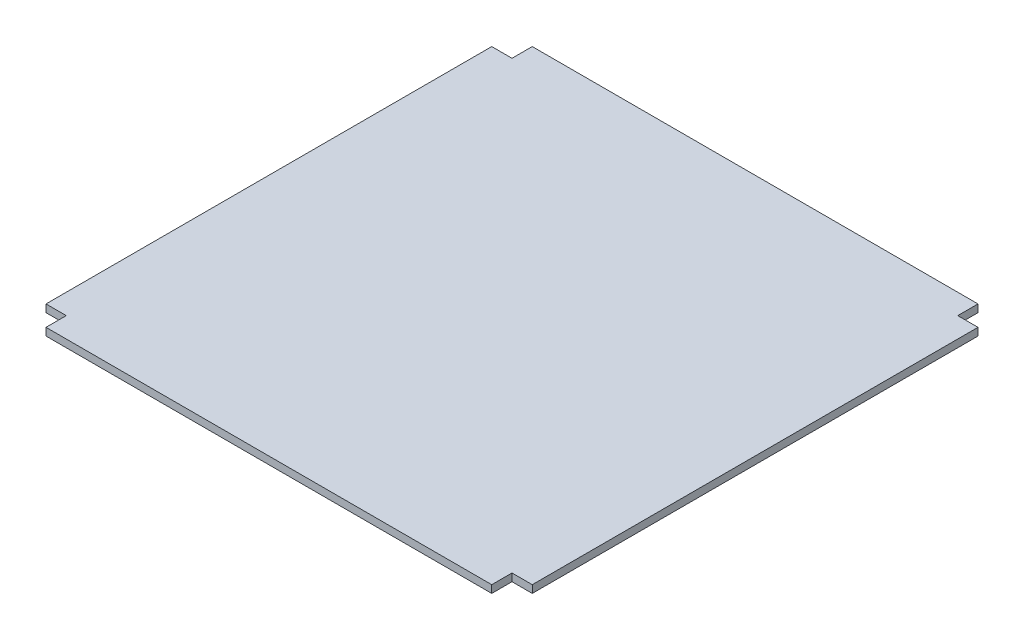
ISO-10303-21;
HEADER;
FILE_DESCRIPTION(('STEP AP214'),'2;1');
FILE_NAME('part.step','',(''),(''),'','','');
FILE_SCHEMA(('AUTOMOTIVE_DESIGN { 1 0 10303 214 1 1 1 1 }'));
ENDSEC;
DATA;
#1=APPLICATION_CONTEXT('core data for automotive mechanical design processes');
#2=APPLICATION_PROTOCOL_DEFINITION('international standard','automotive_design',2000,#1);
#3=PRODUCT_CONTEXT('',#1,'mechanical');
#4=PRODUCT('Part','Part','',(#3));
#5=PRODUCT_RELATED_PRODUCT_CATEGORY('part','',(#4));
#6=PRODUCT_DEFINITION_FORMATION('','',#4);
#7=PRODUCT_DEFINITION_CONTEXT('part definition',#1,'design');
#8=PRODUCT_DEFINITION('design','',#6,#7);
#9=PRODUCT_DEFINITION_SHAPE('','',#8);
#10=(LENGTH_UNIT() NAMED_UNIT(*) SI_UNIT(.MILLI.,.METRE.));
#11=(NAMED_UNIT(*) PLANE_ANGLE_UNIT() SI_UNIT($,.RADIAN.));
#12=(NAMED_UNIT(*) SI_UNIT($,.STERADIAN.) SOLID_ANGLE_UNIT());
#13=UNCERTAINTY_MEASURE_WITH_UNIT(LENGTH_MEASURE(1.E-05),#10,'distance_accuracy_value','');
#14=(GEOMETRIC_REPRESENTATION_CONTEXT(3) GLOBAL_UNCERTAINTY_ASSIGNED_CONTEXT((#13)) GLOBAL_UNIT_ASSIGNED_CONTEXT((#10,
#11,#12)) REPRESENTATION_CONTEXT('',''));
#15=CARTESIAN_POINT('',(0.,0.,0.));
#16=DIRECTION('',(0.,0.,1.));
#17=DIRECTION('',(1.,0.,0.));
#18=AXIS2_PLACEMENT_3D('',#15,#16,#17);
#19=CARTESIAN_POINT('',(609.6,9.525,609.6));
#20=DIRECTION('',(-1.,0.,0.));
#21=DIRECTION('',(0.,0.,1.));
#22=AXIS2_PLACEMENT_3D('',#19,#20,#21);
#23=PLANE('',#22);
#24=DIRECTION('',(0.,0.,-1.));
#25=VECTOR('',#24,1.);
#26=CARTESIAN_POINT('',(609.6,9.525,609.6));
#27=LINE('',#26,#25);
#28=CARTESIAN_POINT('',(609.600000000001,9.525,558.8));
#29=VERTEX_POINT('',#28);
#30=CARTESIAN_POINT('',(609.6,9.525,-558.8));
#31=VERTEX_POINT('',#30);
#32=EDGE_CURVE('E156',#29,#31,#27,.T.);
#33=ORIENTED_EDGE('',*,*,#32,.F.);
#34=DIRECTION('',(0.,1.,0.));
#35=VECTOR('',#34,1.);
#36=CARTESIAN_POINT('',(609.600000000001,-9.525,558.8));
#37=LINE('',#36,#35);
#38=CARTESIAN_POINT('',(609.600000000001,-9.525,558.8));
#39=VERTEX_POINT('',#38);
#40=EDGE_CURVE('E258',#39,#29,#37,.T.);
#41=ORIENTED_EDGE('',*,*,#40,.F.);
#42=DIRECTION('',(0.,0.,-1.));
#43=VECTOR('',#42,1.);
#44=CARTESIAN_POINT('',(609.6,-9.525,609.6));
#45=LINE('',#44,#43);
#46=CARTESIAN_POINT('',(609.6,-9.525,-558.8));
#47=VERTEX_POINT('',#46);
#48=EDGE_CURVE('E158',#39,#47,#45,.T.);
#49=ORIENTED_EDGE('',*,*,#48,.T.);
#50=DIRECTION('',(0.,1.,0.));
#51=VECTOR('',#50,1.);
#52=CARTESIAN_POINT('',(609.6,-9.525,-558.8));
#53=LINE('',#52,#51);
#54=EDGE_CURVE('E140',#47,#31,#53,.T.);
#55=ORIENTED_EDGE('',*,*,#54,.T.);
#56=EDGE_LOOP('',(#33,#41,#49,#55));
#57=FACE_BOUND('',#56,.T.);
#58=ADVANCED_FACE('F47',(#57),#23,.F.);
#59=CARTESIAN_POINT('',(-609.6,9.525,-609.6));
#60=DIRECTION('',(0.,0.,1.));
#61=DIRECTION('',(1.,0.,0.));
#62=AXIS2_PLACEMENT_3D('',#59,#60,#61);
#63=PLANE('',#62);
#64=DIRECTION('',(-1.,0.,0.));
#65=VECTOR('',#64,1.);
#66=CARTESIAN_POINT('',(-609.6,9.525,-609.6));
#67=LINE('',#66,#65);
#68=CARTESIAN_POINT('',(558.800000000001,9.525,-609.6));
#69=VERTEX_POINT('',#68);
#70=CARTESIAN_POINT('',(-558.800000000001,9.525,-609.6));
#71=VERTEX_POINT('',#70);
#72=EDGE_CURVE('E168',#69,#71,#67,.T.);
#73=ORIENTED_EDGE('',*,*,#72,.F.);
#74=DIRECTION('',(0.,1.,0.));
#75=VECTOR('',#74,1.);
#76=CARTESIAN_POINT('',(558.800000000001,-9.525,-609.6));
#77=LINE('',#76,#75);
#78=CARTESIAN_POINT('',(558.800000000001,-9.525,-609.6));
#79=VERTEX_POINT('',#78);
#80=EDGE_CURVE('E248',#79,#69,#77,.T.);
#81=ORIENTED_EDGE('',*,*,#80,.F.);
#82=DIRECTION('',(-1.,0.,0.));
#83=VECTOR('',#82,1.);
#84=CARTESIAN_POINT('',(-609.6,-9.525,-609.6));
#85=LINE('',#84,#83);
#86=CARTESIAN_POINT('',(-558.800000000001,-9.525,-609.6));
#87=VERTEX_POINT('',#86);
#88=EDGE_CURVE('E184',#79,#87,#85,.T.);
#89=ORIENTED_EDGE('',*,*,#88,.T.);
#90=DIRECTION('',(0.,1.,0.));
#91=VECTOR('',#90,1.);
#92=CARTESIAN_POINT('',(-558.800000000001,-9.525,-609.6));
#93=LINE('',#92,#91);
#94=EDGE_CURVE('E185',#87,#71,#93,.T.);
#95=ORIENTED_EDGE('',*,*,#94,.T.);
#96=EDGE_LOOP('',(#73,#81,#89,#95));
#97=FACE_BOUND('',#96,.T.);
#98=ADVANCED_FACE('F245',(#97),#63,.F.);
#99=CARTESIAN_POINT('',(-609.6,9.525,609.6));
#100=DIRECTION('',(1.,0.,0.));
#101=DIRECTION('',(0.,0.,-1.));
#102=AXIS2_PLACEMENT_3D('',#99,#100,#101);
#103=PLANE('',#102);
#104=DIRECTION('',(0.,0.,1.));
#105=VECTOR('',#104,1.);
#106=CARTESIAN_POINT('',(-609.6,-9.525,609.6));
#107=LINE('',#106,#105);
#108=CARTESIAN_POINT('',(-609.6,-9.525,-558.8));
#109=VERTEX_POINT('',#108);
#110=CARTESIAN_POINT('',(-609.6,-9.525,558.8));
#111=VERTEX_POINT('',#110);
#112=EDGE_CURVE('E175',#109,#111,#107,.T.);
#113=ORIENTED_EDGE('',*,*,#112,.T.);
#114=DIRECTION('',(0.,1.,0.));
#115=VECTOR('',#114,1.);
#116=CARTESIAN_POINT('',(-609.6,-9.525,558.8));
#117=LINE('',#116,#115);
#118=CARTESIAN_POINT('',(-609.6,9.525,558.8));
#119=VERTEX_POINT('',#118);
#120=EDGE_CURVE('E196',#111,#119,#117,.T.);
#121=ORIENTED_EDGE('',*,*,#120,.T.);
#122=DIRECTION('',(0.,0.,1.));
#123=VECTOR('',#122,1.);
#124=CARTESIAN_POINT('',(-609.6,9.525,609.6));
#125=LINE('',#124,#123);
#126=CARTESIAN_POINT('',(-609.6,9.525,-558.8));
#127=VERTEX_POINT('',#126);
#128=EDGE_CURVE('E56',#127,#119,#125,.T.);
#129=ORIENTED_EDGE('',*,*,#128,.F.);
#130=DIRECTION('',(0.,1.,0.));
#131=VECTOR('',#130,1.);
#132=CARTESIAN_POINT('',(-609.6,-9.525,-558.8));
#133=LINE('',#132,#131);
#134=EDGE_CURVE('E177',#109,#127,#133,.T.);
#135=ORIENTED_EDGE('',*,*,#134,.F.);
#136=EDGE_LOOP('',(#113,#121,#129,#135));
#137=FACE_BOUND('',#136,.T.);
#138=ADVANCED_FACE('F194',(#137),#103,.F.);
#139=CARTESIAN_POINT('',(-609.6,9.525,609.6));
#140=DIRECTION('',(0.,0.,-1.));
#141=DIRECTION('',(-1.,0.,0.));
#142=AXIS2_PLACEMENT_3D('',#139,#140,#141);
#143=PLANE('',#142);
#144=DIRECTION('',(1.,0.,0.));
#145=VECTOR('',#144,1.);
#146=CARTESIAN_POINT('',(-609.6,9.525,609.6));
#147=LINE('',#146,#145);
#148=CARTESIAN_POINT('',(-558.8,9.525,609.6));
#149=VERTEX_POINT('',#148);
#150=CARTESIAN_POINT('',(558.800000000001,9.525,609.6));
#151=VERTEX_POINT('',#150);
#152=EDGE_CURVE('E11',#149,#151,#147,.T.);
#153=ORIENTED_EDGE('',*,*,#152,.F.);
#154=DIRECTION('',(0.,1.,0.));
#155=VECTOR('',#154,1.);
#156=CARTESIAN_POINT('',(-558.8,-9.525,609.6));
#157=LINE('',#156,#155);
#158=CARTESIAN_POINT('',(-558.8,-9.525,609.6));
#159=VERTEX_POINT('',#158);
#160=EDGE_CURVE('E206',#159,#149,#157,.T.);
#161=ORIENTED_EDGE('',*,*,#160,.F.);
#162=DIRECTION('',(1.,0.,0.));
#163=VECTOR('',#162,1.);
#164=CARTESIAN_POINT('',(-609.6,-9.525,609.6));
#165=LINE('',#164,#163);
#166=CARTESIAN_POINT('',(558.800000000001,-9.525,609.6));
#167=VERTEX_POINT('',#166);
#168=EDGE_CURVE('E50',#159,#167,#165,.T.);
#169=ORIENTED_EDGE('',*,*,#168,.T.);
#170=DIRECTION('',(0.,1.,0.));
#171=VECTOR('',#170,1.);
#172=CARTESIAN_POINT('',(558.800000000001,-9.525,609.6));
#173=LINE('',#172,#171);
#174=EDGE_CURVE('E264',#167,#151,#173,.T.);
#175=ORIENTED_EDGE('',*,*,#174,.T.);
#176=EDGE_LOOP('',(#153,#161,#169,#175));
#177=FACE_BOUND('',#176,.T.);
#178=ADVANCED_FACE('F291',(#177),#143,.F.);
#179=CARTESIAN_POINT('',(0.,9.525,0.));
#180=DIRECTION('',(0.,-1.,0.));
#181=DIRECTION('',(0.,0.,-1.));
#182=AXIS2_PLACEMENT_3D('',#179,#180,#181);
#183=PLANE('',#182);
#184=ORIENTED_EDGE('',*,*,#128,.T.);
#185=DIRECTION('',(-1.,0.,0.));
#186=VECTOR('',#185,1.);
#187=CARTESIAN_POINT('',(-609.6,9.525,558.8));
#188=LINE('',#187,#186);
#189=CARTESIAN_POINT('',(-558.8,9.525,558.8));
#190=VERTEX_POINT('',#189);
#191=EDGE_CURVE('E210',#190,#119,#188,.T.);
#192=ORIENTED_EDGE('',*,*,#191,.F.);
#193=DIRECTION('',(0.,0.,-1.));
#194=VECTOR('',#193,1.);
#195=CARTESIAN_POINT('',(-558.8,9.525,609.6));
#196=LINE('',#195,#194);
#197=EDGE_CURVE('E215',#149,#190,#196,.T.);
#198=ORIENTED_EDGE('',*,*,#197,.F.);
#199=ORIENTED_EDGE('',*,*,#152,.T.);
#200=DIRECTION('',(0.,0.,1.));
#201=VECTOR('',#200,1.);
#202=CARTESIAN_POINT('',(558.800000000001,9.525,609.6));
#203=LINE('',#202,#201);
#204=CARTESIAN_POINT('',(558.800000000001,9.525,558.8));
#205=VERTEX_POINT('',#204);
#206=EDGE_CURVE('E268',#205,#151,#203,.T.);
#207=ORIENTED_EDGE('',*,*,#206,.F.);
#208=DIRECTION('',(-1.,0.,0.));
#209=VECTOR('',#208,1.);
#210=CARTESIAN_POINT('',(609.600000000001,9.525,558.8));
#211=LINE('',#210,#209);
#212=EDGE_CURVE('E160',#29,#205,#211,.T.);
#213=ORIENTED_EDGE('',*,*,#212,.F.);
#214=ORIENTED_EDGE('',*,*,#32,.T.);
#215=DIRECTION('',(1.,0.,0.));
#216=VECTOR('',#215,1.);
#217=CARTESIAN_POINT('',(609.6,9.525,-558.8));
#218=LINE('',#217,#216);
#219=CARTESIAN_POINT('',(558.800000000001,9.525,-558.8));
#220=VERTEX_POINT('',#219);
#221=EDGE_CURVE('E137',#220,#31,#218,.T.);
#222=ORIENTED_EDGE('',*,*,#221,.F.);
#223=DIRECTION('',(0.,0.,1.));
#224=VECTOR('',#223,1.);
#225=CARTESIAN_POINT('',(558.800000000001,9.525,-609.6));
#226=LINE('',#225,#224);
#227=EDGE_CURVE('E149',#69,#220,#226,.T.);
#228=ORIENTED_EDGE('',*,*,#227,.F.);
#229=ORIENTED_EDGE('',*,*,#72,.T.);
#230=DIRECTION('',(0.,0.,-1.));
#231=VECTOR('',#230,1.);
#232=CARTESIAN_POINT('',(-558.800000000001,9.525,-609.6));
#233=LINE('',#232,#231);
#234=CARTESIAN_POINT('',(-558.800000000001,9.525,-558.8));
#235=VERTEX_POINT('',#234);
#236=EDGE_CURVE('E221',#235,#71,#233,.T.);
#237=ORIENTED_EDGE('',*,*,#236,.F.);
#238=DIRECTION('',(1.,0.,0.));
#239=VECTOR('',#238,1.);
#240=CARTESIAN_POINT('',(-609.6,9.525,-558.8));
#241=LINE('',#240,#239);
#242=EDGE_CURVE('E224',#127,#235,#241,.T.);
#243=ORIENTED_EDGE('',*,*,#242,.F.);
#244=EDGE_LOOP('',(#184,#192,#198,#199,#207,#213,#214,#222,#228,#229,#237,#243));
#245=FACE_BOUND('',#244,.T.);
#246=ADVANCED_FACE('F164',(#245),#183,.F.);
#247=CARTESIAN_POINT('',(0.,-9.525,0.));
#248=DIRECTION('',(0.,-1.,0.));
#249=DIRECTION('',(0.,0.,-1.));
#250=AXIS2_PLACEMENT_3D('',#247,#248,#249);
#251=PLANE('',#250);
#252=DIRECTION('',(-1.,0.,0.));
#253=VECTOR('',#252,1.);
#254=CARTESIAN_POINT('',(-609.6,-9.525,558.8));
#255=LINE('',#254,#253);
#256=CARTESIAN_POINT('',(-558.8,-9.525,558.8));
#257=VERTEX_POINT('',#256);
#258=EDGE_CURVE('E64',#257,#111,#255,.T.);
#259=ORIENTED_EDGE('',*,*,#258,.T.);
#260=ORIENTED_EDGE('',*,*,#112,.F.);
#261=DIRECTION('',(1.,0.,0.));
#262=VECTOR('',#261,1.);
#263=CARTESIAN_POINT('',(-609.6,-9.525,-558.8));
#264=LINE('',#263,#262);
#265=CARTESIAN_POINT('',(-558.800000000001,-9.525,-558.8));
#266=VERTEX_POINT('',#265);
#267=EDGE_CURVE('E201',#109,#266,#264,.T.);
#268=ORIENTED_EDGE('',*,*,#267,.T.);
#269=DIRECTION('',(0.,0.,-1.));
#270=VECTOR('',#269,1.);
#271=CARTESIAN_POINT('',(-558.800000000001,-9.525,-609.6));
#272=LINE('',#271,#270);
#273=EDGE_CURVE('E220',#266,#87,#272,.T.);
#274=ORIENTED_EDGE('',*,*,#273,.T.);
#275=ORIENTED_EDGE('',*,*,#88,.F.);
#276=DIRECTION('',(0.,0.,1.));
#277=VECTOR('',#276,1.);
#278=CARTESIAN_POINT('',(558.800000000001,-9.525,-609.6));
#279=LINE('',#278,#277);
#280=CARTESIAN_POINT('',(558.800000000001,-9.525,-558.8));
#281=VERTEX_POINT('',#280);
#282=EDGE_CURVE('E150',#79,#281,#279,.T.);
#283=ORIENTED_EDGE('',*,*,#282,.T.);
#284=DIRECTION('',(1.,0.,0.));
#285=VECTOR('',#284,1.);
#286=CARTESIAN_POINT('',(609.6,-9.525,-558.8));
#287=LINE('',#286,#285);
#288=EDGE_CURVE('E250',#281,#47,#287,.T.);
#289=ORIENTED_EDGE('',*,*,#288,.T.);
#290=ORIENTED_EDGE('',*,*,#48,.F.);
#291=DIRECTION('',(-1.,0.,0.));
#292=VECTOR('',#291,1.);
#293=CARTESIAN_POINT('',(609.600000000001,-9.525,558.8));
#294=LINE('',#293,#292);
#295=CARTESIAN_POINT('',(558.800000000001,-9.525,558.8));
#296=VERTEX_POINT('',#295);
#297=EDGE_CURVE('E271',#39,#296,#294,.T.);
#298=ORIENTED_EDGE('',*,*,#297,.T.);
#299=DIRECTION('',(0.,0.,1.));
#300=VECTOR('',#299,1.);
#301=CARTESIAN_POINT('',(558.800000000001,-9.525,609.6));
#302=LINE('',#301,#300);
#303=EDGE_CURVE('E72',#296,#167,#302,.T.);
#304=ORIENTED_EDGE('',*,*,#303,.T.);
#305=ORIENTED_EDGE('',*,*,#168,.F.);
#306=DIRECTION('',(0.,0.,-1.));
#307=VECTOR('',#306,1.);
#308=CARTESIAN_POINT('',(-558.8,-9.525,609.6));
#309=LINE('',#308,#307);
#310=EDGE_CURVE('E204',#159,#257,#309,.T.);
#311=ORIENTED_EDGE('',*,*,#310,.T.);
#312=EDGE_LOOP('',(#259,#260,#268,#274,#275,#283,#289,#290,#298,#304,#305,#311));
#313=FACE_BOUND('',#312,.T.);
#314=ADVANCED_FACE('F199',(#313),#251,.T.);
#315=CARTESIAN_POINT('',(-558.800000000001,-9.525,-609.6));
#316=DIRECTION('',(1.,0.,0.));
#317=DIRECTION('',(0.,0.,-1.));
#318=AXIS2_PLACEMENT_3D('',#315,#316,#317);
#319=PLANE('',#318);
#320=ORIENTED_EDGE('',*,*,#236,.T.);
#321=ORIENTED_EDGE('',*,*,#94,.F.);
#322=ORIENTED_EDGE('',*,*,#273,.F.);
#323=DIRECTION('',(0.,1.,0.));
#324=VECTOR('',#323,1.);
#325=CARTESIAN_POINT('',(-558.800000000001,-9.525,-558.8));
#326=LINE('',#325,#324);
#327=EDGE_CURVE('E232',#266,#235,#326,.T.);
#328=ORIENTED_EDGE('',*,*,#327,.T.);
#329=EDGE_LOOP('',(#320,#321,#322,#328));
#330=FACE_BOUND('',#329,.T.);
#331=ADVANCED_FACE('F243',(#330),#319,.F.);
#332=CARTESIAN_POINT('',(-609.6,-9.525,-558.8));
#333=DIRECTION('',(0.,0.,1.));
#334=DIRECTION('',(1.,0.,0.));
#335=AXIS2_PLACEMENT_3D('',#332,#333,#334);
#336=PLANE('',#335);
#337=ORIENTED_EDGE('',*,*,#242,.T.);
#338=ORIENTED_EDGE('',*,*,#327,.F.);
#339=ORIENTED_EDGE('',*,*,#267,.F.);
#340=ORIENTED_EDGE('',*,*,#134,.T.);
#341=EDGE_LOOP('',(#337,#338,#339,#340));
#342=FACE_BOUND('',#341,.T.);
#343=ADVANCED_FACE('F239',(#342),#336,.F.);
#344=CARTESIAN_POINT('',(609.6,-9.525,-558.8));
#345=DIRECTION('',(0.,0.,1.));
#346=DIRECTION('',(1.,0.,0.));
#347=AXIS2_PLACEMENT_3D('',#344,#345,#346);
#348=PLANE('',#347);
#349=ORIENTED_EDGE('',*,*,#221,.T.);
#350=ORIENTED_EDGE('',*,*,#54,.F.);
#351=ORIENTED_EDGE('',*,*,#288,.F.);
#352=DIRECTION('',(0.,1.,0.));
#353=VECTOR('',#352,1.);
#354=CARTESIAN_POINT('',(558.800000000001,-9.525,-558.8));
#355=LINE('',#354,#353);
#356=EDGE_CURVE('E143',#281,#220,#355,.T.);
#357=ORIENTED_EDGE('',*,*,#356,.T.);
#358=EDGE_LOOP('',(#349,#350,#351,#357));
#359=FACE_BOUND('',#358,.T.);
#360=ADVANCED_FACE('F139',(#359),#348,.F.);
#361=CARTESIAN_POINT('',(558.800000000001,-9.525,-609.6));
#362=DIRECTION('',(-1.,0.,0.));
#363=DIRECTION('',(0.,0.,1.));
#364=AXIS2_PLACEMENT_3D('',#361,#362,#363);
#365=PLANE('',#364);
#366=ORIENTED_EDGE('',*,*,#227,.T.);
#367=ORIENTED_EDGE('',*,*,#356,.F.);
#368=ORIENTED_EDGE('',*,*,#282,.F.);
#369=ORIENTED_EDGE('',*,*,#80,.T.);
#370=EDGE_LOOP('',(#366,#367,#368,#369));
#371=FACE_BOUND('',#370,.T.);
#372=ADVANCED_FACE('F303',(#371),#365,.F.);
#373=CARTESIAN_POINT('',(558.800000000001,-9.525,609.6));
#374=DIRECTION('',(-1.,0.,0.));
#375=DIRECTION('',(0.,0.,1.));
#376=AXIS2_PLACEMENT_3D('',#373,#374,#375);
#377=PLANE('',#376);
#378=ORIENTED_EDGE('',*,*,#206,.T.);
#379=ORIENTED_EDGE('',*,*,#174,.F.);
#380=ORIENTED_EDGE('',*,*,#303,.F.);
#381=DIRECTION('',(0.,1.,0.));
#382=VECTOR('',#381,1.);
#383=CARTESIAN_POINT('',(558.800000000001,-9.525,558.8));
#384=LINE('',#383,#382);
#385=EDGE_CURVE('E261',#296,#205,#384,.T.);
#386=ORIENTED_EDGE('',*,*,#385,.T.);
#387=EDGE_LOOP('',(#378,#379,#380,#386));
#388=FACE_BOUND('',#387,.T.);
#389=ADVANCED_FACE('F292',(#388),#377,.F.);
#390=CARTESIAN_POINT('',(609.600000000001,-9.525,558.8));
#391=DIRECTION('',(0.,0.,-1.));
#392=DIRECTION('',(-1.,0.,0.));
#393=AXIS2_PLACEMENT_3D('',#390,#391,#392);
#394=PLANE('',#393);
#395=ORIENTED_EDGE('',*,*,#212,.T.);
#396=ORIENTED_EDGE('',*,*,#385,.F.);
#397=ORIENTED_EDGE('',*,*,#297,.F.);
#398=ORIENTED_EDGE('',*,*,#40,.T.);
#399=EDGE_LOOP('',(#395,#396,#397,#398));
#400=FACE_BOUND('',#399,.T.);
#401=ADVANCED_FACE('F294',(#400),#394,.F.);
#402=CARTESIAN_POINT('',(-609.6,-9.525,558.8));
#403=DIRECTION('',(0.,0.,-1.));
#404=DIRECTION('',(-1.,0.,0.));
#405=AXIS2_PLACEMENT_3D('',#402,#403,#404);
#406=PLANE('',#405);
#407=ORIENTED_EDGE('',*,*,#191,.T.);
#408=ORIENTED_EDGE('',*,*,#120,.F.);
#409=ORIENTED_EDGE('',*,*,#258,.F.);
#410=DIRECTION('',(0.,1.,0.));
#411=VECTOR('',#410,1.);
#412=CARTESIAN_POINT('',(-558.8,-9.525,558.8));
#413=LINE('',#412,#411);
#414=EDGE_CURVE('E212',#257,#190,#413,.T.);
#415=ORIENTED_EDGE('',*,*,#414,.T.);
#416=EDGE_LOOP('',(#407,#408,#409,#415));
#417=FACE_BOUND('',#416,.T.);
#418=ADVANCED_FACE('F296',(#417),#406,.F.);
#419=CARTESIAN_POINT('',(-558.8,-9.525,609.6));
#420=DIRECTION('',(1.,0.,0.));
#421=DIRECTION('',(0.,0.,-1.));
#422=AXIS2_PLACEMENT_3D('',#419,#420,#421);
#423=PLANE('',#422);
#424=ORIENTED_EDGE('',*,*,#197,.T.);
#425=ORIENTED_EDGE('',*,*,#414,.F.);
#426=ORIENTED_EDGE('',*,*,#310,.F.);
#427=ORIENTED_EDGE('',*,*,#160,.T.);
#428=EDGE_LOOP('',(#424,#425,#426,#427));
#429=FACE_BOUND('',#428,.T.);
#430=ADVANCED_FACE('F287',(#429),#423,.F.);
#431=CLOSED_SHELL('',(#58,#98,#138,#178,#246,#314,#331,#343,#360,#372,#389,#401,#418,#430));
#432=MANIFOLD_SOLID_BREP('B2',#431);
#433=ADVANCED_BREP_SHAPE_REPRESENTATION('',(#18,#432),#14);
#434=SHAPE_DEFINITION_REPRESENTATION(#9,#433);
ENDSEC;
END-ISO-10303-21;
